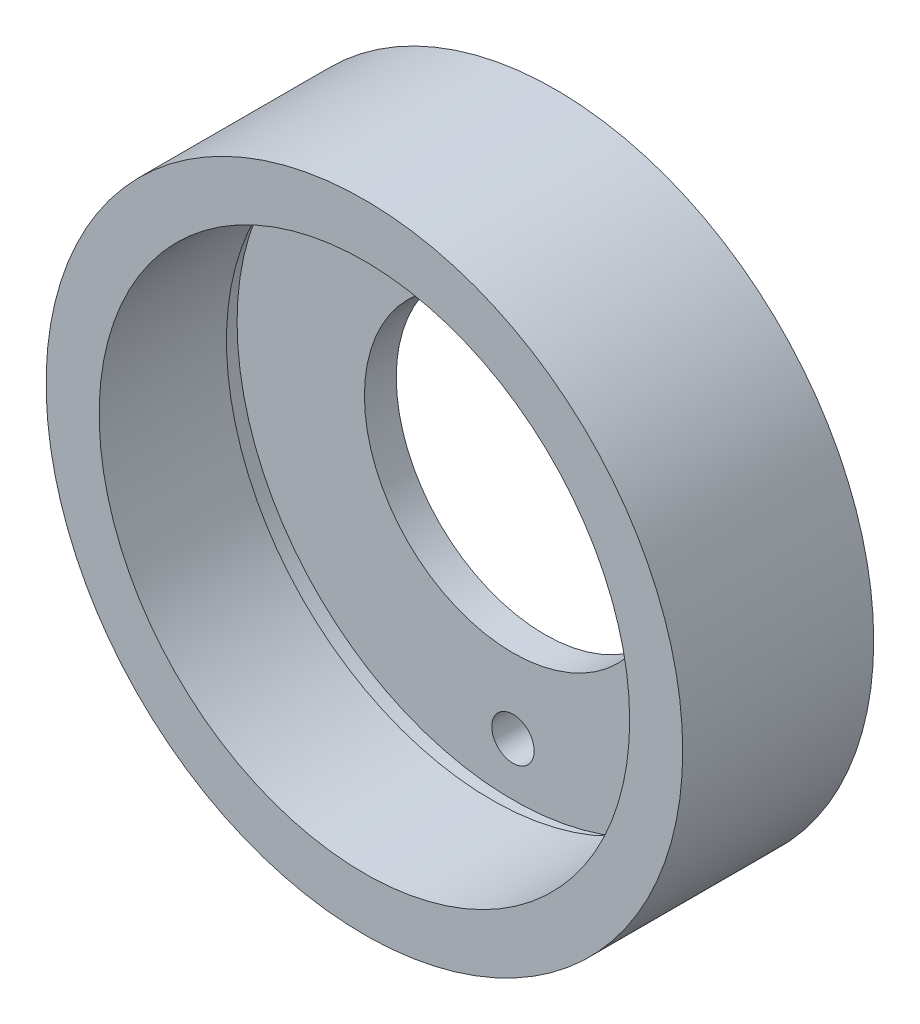
ISO-10303-21;
HEADER;
FILE_DESCRIPTION(('STEP AP214'),'2;1');
FILE_NAME('part.step','',(''),(''),'','','');
FILE_SCHEMA(('AUTOMOTIVE_DESIGN { 1 0 10303 214 1 1 1 1 }'));
ENDSEC;
DATA;
#1=APPLICATION_CONTEXT('core data for automotive mechanical design processes');
#2=APPLICATION_PROTOCOL_DEFINITION('international standard','automotive_design',2000,#1);
#3=PRODUCT_CONTEXT('',#1,'mechanical');
#4=PRODUCT('Part','Part','',(#3));
#5=PRODUCT_RELATED_PRODUCT_CATEGORY('part','',(#4));
#6=PRODUCT_DEFINITION_FORMATION('','',#4);
#7=PRODUCT_DEFINITION_CONTEXT('part definition',#1,'design');
#8=PRODUCT_DEFINITION('design','',#6,#7);
#9=PRODUCT_DEFINITION_SHAPE('','',#8);
#10=(LENGTH_UNIT() NAMED_UNIT(*) SI_UNIT(.MILLI.,.METRE.));
#11=(NAMED_UNIT(*) PLANE_ANGLE_UNIT() SI_UNIT($,.RADIAN.));
#12=(NAMED_UNIT(*) SI_UNIT($,.STERADIAN.) SOLID_ANGLE_UNIT());
#13=UNCERTAINTY_MEASURE_WITH_UNIT(LENGTH_MEASURE(1.E-05),#10,'distance_accuracy_value','');
#14=(GEOMETRIC_REPRESENTATION_CONTEXT(3) GLOBAL_UNCERTAINTY_ASSIGNED_CONTEXT((#13)) GLOBAL_UNIT_ASSIGNED_CONTEXT((#10,
#11,#12)) REPRESENTATION_CONTEXT('',''));
#15=CARTESIAN_POINT('',(0.,0.,0.));
#16=DIRECTION('',(0.,0.,1.));
#17=DIRECTION('',(1.,0.,0.));
#18=AXIS2_PLACEMENT_3D('',#15,#16,#17);
#19=CARTESIAN_POINT('',(0.,0.,2.));
#20=DIRECTION('',(0.,0.,-1.));
#21=DIRECTION('',(-1.,0.,0.));
#22=AXIS2_PLACEMENT_3D('',#19,#20,#21);
#23=CYLINDRICAL_SURFACE('',#22,15.);
#24=CARTESIAN_POINT('',(0.,0.,0.));
#25=DIRECTION('',(0.,0.,1.));
#26=DIRECTION('',(1.,0.,0.));
#27=AXIS2_PLACEMENT_3D('',#24,#25,#26);
#28=CIRCLE('',#27,15.);
#29=CARTESIAN_POINT('',(15.,0.,0.));
#30=VERTEX_POINT('',#29);
#31=EDGE_CURVE('E56',#30,#30,#28,.T.);
#32=ORIENTED_EDGE('',*,*,#31,.T.);
#33=EDGE_LOOP('',(#32));
#34=FACE_BOUND('',#33,.T.);
#35=CARTESIAN_POINT('',(0.,0.,9.));
#36=DIRECTION('',(0.,0.,1.));
#37=DIRECTION('',(1.,0.,0.));
#38=AXIS2_PLACEMENT_3D('',#35,#36,#37);
#39=CIRCLE('',#38,15.);
#40=CARTESIAN_POINT('',(15.,0.,9.));
#41=VERTEX_POINT('',#40);
#42=EDGE_CURVE('E94',#41,#41,#39,.T.);
#43=ORIENTED_EDGE('',*,*,#42,.F.);
#44=EDGE_LOOP('',(#43));
#45=FACE_BOUND('',#44,.T.);
#46=ADVANCED_FACE('F49',(#34,#45),#23,.T.);
#47=CARTESIAN_POINT('',(0.,0.,0.));
#48=DIRECTION('',(0.,0.,1.));
#49=DIRECTION('',(1.,0.,0.));
#50=AXIS2_PLACEMENT_3D('',#47,#48,#49);
#51=PLANE('',#50);
#52=CARTESIAN_POINT('',(0.,10.5,0.));
#53=DIRECTION('',(0.,0.,-1.));
#54=DIRECTION('',(-1.,0.,0.));
#55=AXIS2_PLACEMENT_3D('',#52,#53,#54);
#56=CIRCLE('',#55,1.025);
#57=CARTESIAN_POINT('',(-1.025,10.5,0.));
#58=VERTEX_POINT('',#57);
#59=EDGE_CURVE('E175',#58,#58,#56,.T.);
#60=ORIENTED_EDGE('',*,*,#59,.F.);
#61=EDGE_LOOP('',(#60));
#62=FACE_BOUND('',#61,.T.);
#63=CARTESIAN_POINT('',(0.,-10.5,0.));
#64=DIRECTION('',(0.,0.,-1.));
#65=DIRECTION('',(-1.,0.,0.));
#66=AXIS2_PLACEMENT_3D('',#63,#64,#65);
#67=CIRCLE('',#66,1.025);
#68=CARTESIAN_POINT('',(-1.02499999999993,-10.5,0.));
#69=VERTEX_POINT('',#68);
#70=EDGE_CURVE('E74',#69,#69,#67,.T.);
#71=ORIENTED_EDGE('',*,*,#70,.F.);
#72=EDGE_LOOP('',(#71));
#73=FACE_BOUND('',#72,.T.);
#74=CARTESIAN_POINT('',(0.,0.,0.));
#75=DIRECTION('',(0.,0.,-1.));
#76=DIRECTION('',(-1.,0.,0.));
#77=AXIS2_PLACEMENT_3D('',#74,#75,#76);
#78=CIRCLE('',#77,8.5);
#79=CARTESIAN_POINT('',(-8.5,0.,0.));
#80=VERTEX_POINT('',#79);
#81=EDGE_CURVE('E83',#80,#80,#78,.T.);
#82=ORIENTED_EDGE('',*,*,#81,.F.);
#83=EDGE_LOOP('',(#82));
#84=FACE_BOUND('',#83,.T.);
#85=ORIENTED_EDGE('',*,*,#31,.F.);
#86=EDGE_LOOP('',(#85));
#87=FACE_BOUND('',#86,.T.);
#88=ADVANCED_FACE('F106',(#62,#73,#84,#87),#51,.F.);
#89=CARTESIAN_POINT('',(0.,0.,3.));
#90=DIRECTION('',(0.,0.,1.));
#91=DIRECTION('',(1.,0.,0.));
#92=AXIS2_PLACEMENT_3D('',#89,#90,#91);
#93=PLANE('',#92);
#94=CARTESIAN_POINT('',(0.,0.,3.));
#95=DIRECTION('',(0.,0.,1.));
#96=DIRECTION('',(1.,0.,0.));
#97=AXIS2_PLACEMENT_3D('',#94,#95,#96);
#98=CIRCLE('',#97,12.5);
#99=CARTESIAN_POINT('',(12.5,0.,3.));
#100=VERTEX_POINT('',#99);
#101=EDGE_CURVE('E88',#100,#100,#98,.T.);
#102=ORIENTED_EDGE('',*,*,#101,.T.);
#103=EDGE_LOOP('',(#102));
#104=FACE_BOUND('',#103,.T.);
#105=CARTESIAN_POINT('',(0.,0.,3.));
#106=DIRECTION('',(0.,0.,1.));
#107=DIRECTION('',(1.,0.,0.));
#108=AXIS2_PLACEMENT_3D('',#105,#106,#107);
#109=CIRCLE('',#108,13.);
#110=CARTESIAN_POINT('',(13.,0.,3.));
#111=VERTEX_POINT('',#110);
#112=EDGE_CURVE('E61',#111,#111,#109,.T.);
#113=ORIENTED_EDGE('',*,*,#112,.F.);
#114=EDGE_LOOP('',(#113));
#115=FACE_BOUND('',#114,.T.);
#116=ADVANCED_FACE('F103',(#104,#115),#93,.F.);
#117=CARTESIAN_POINT('',(0.,0.,9.));
#118=DIRECTION('',(0.,0.,1.));
#119=DIRECTION('',(1.,0.,0.));
#120=AXIS2_PLACEMENT_3D('',#117,#118,#119);
#121=PLANE('',#120);
#122=ORIENTED_EDGE('',*,*,#42,.T.);
#123=EDGE_LOOP('',(#122));
#124=FACE_BOUND('',#123,.T.);
#125=CARTESIAN_POINT('',(0.,0.,9.));
#126=DIRECTION('',(0.,0.,1.));
#127=DIRECTION('',(1.,0.,0.));
#128=AXIS2_PLACEMENT_3D('',#125,#126,#127);
#129=CIRCLE('',#128,12.5);
#130=CARTESIAN_POINT('',(12.5,0.,9.));
#131=VERTEX_POINT('',#130);
#132=EDGE_CURVE('E91',#131,#131,#129,.T.);
#133=ORIENTED_EDGE('',*,*,#132,.F.);
#134=EDGE_LOOP('',(#133));
#135=FACE_BOUND('',#134,.T.);
#136=ADVANCED_FACE('F105',(#124,#135),#121,.T.);
#137=CARTESIAN_POINT('',(0.,0.,9.));
#138=DIRECTION('',(0.,0.,-1.));
#139=DIRECTION('',(-1.,0.,0.));
#140=AXIS2_PLACEMENT_3D('',#137,#138,#139);
#141=CYLINDRICAL_SURFACE('',#140,12.5);
#142=ORIENTED_EDGE('',*,*,#132,.T.);
#143=EDGE_LOOP('',(#142));
#144=FACE_BOUND('',#143,.T.);
#145=ORIENTED_EDGE('',*,*,#101,.F.);
#146=EDGE_LOOP('',(#145));
#147=FACE_BOUND('',#146,.T.);
#148=ADVANCED_FACE('F114',(#144,#147),#141,.F.);
#149=CARTESIAN_POINT('',(0.,0.,2.));
#150=DIRECTION('',(0.,0.,1.));
#151=DIRECTION('',(1.,0.,0.));
#152=AXIS2_PLACEMENT_3D('',#149,#150,#151);
#153=PLANE('',#152);
#154=CARTESIAN_POINT('',(0.,10.5,2.));
#155=DIRECTION('',(0.,0.,1.));
#156=DIRECTION('',(1.,0.,0.));
#157=AXIS2_PLACEMENT_3D('',#154,#155,#156);
#158=CIRCLE('',#157,0.999999999999998);
#159=CARTESIAN_POINT('',(0.999999999999998,10.5,2.));
#160=VERTEX_POINT('',#159);
#161=EDGE_CURVE('E52',#160,#160,#158,.T.);
#162=ORIENTED_EDGE('',*,*,#161,.F.);
#163=EDGE_LOOP('',(#162));
#164=FACE_BOUND('',#163,.T.);
#165=CARTESIAN_POINT('',(0.,-10.5,2.));
#166=DIRECTION('',(0.,0.,1.));
#167=DIRECTION('',(1.,0.,0.));
#168=AXIS2_PLACEMENT_3D('',#165,#166,#167);
#169=CIRCLE('',#168,0.999999999999998);
#170=CARTESIAN_POINT('',(1.00000000000007,-10.5,2.));
#171=VERTEX_POINT('',#170);
#172=EDGE_CURVE('E64',#171,#171,#169,.T.);
#173=ORIENTED_EDGE('',*,*,#172,.F.);
#174=EDGE_LOOP('',(#173));
#175=FACE_BOUND('',#174,.T.);
#176=CARTESIAN_POINT('',(0.,0.,2.));
#177=DIRECTION('',(0.,0.,-1.));
#178=DIRECTION('',(-1.,0.,0.));
#179=AXIS2_PLACEMENT_3D('',#176,#177,#178);
#180=CIRCLE('',#179,7.);
#181=CARTESIAN_POINT('',(-7.,0.,2.));
#182=VERTEX_POINT('',#181);
#183=EDGE_CURVE('E71',#182,#182,#180,.T.);
#184=ORIENTED_EDGE('',*,*,#183,.T.);
#185=EDGE_LOOP('',(#184));
#186=FACE_BOUND('',#185,.T.);
#187=CARTESIAN_POINT('',(0.,0.,2.));
#188=DIRECTION('',(0.,0.,1.));
#189=DIRECTION('',(1.,0.,0.));
#190=AXIS2_PLACEMENT_3D('',#187,#188,#189);
#191=CIRCLE('',#190,13.);
#192=CARTESIAN_POINT('',(13.,0.,2.));
#193=VERTEX_POINT('',#192);
#194=EDGE_CURVE('E10',#193,#193,#191,.F.);
#195=ORIENTED_EDGE('',*,*,#194,.F.);
#196=EDGE_LOOP('',(#195));
#197=FACE_BOUND('',#196,.T.);
#198=ADVANCED_FACE('F132',(#164,#175,#186,#197),#153,.T.);
#199=CARTESIAN_POINT('',(0.,0.,3.));
#200=DIRECTION('',(0.,0.,-1.));
#201=DIRECTION('',(-1.,0.,0.));
#202=AXIS2_PLACEMENT_3D('',#199,#200,#201);
#203=CYLINDRICAL_SURFACE('',#202,13.);
#204=ORIENTED_EDGE('',*,*,#112,.T.);
#205=EDGE_LOOP('',(#204));
#206=FACE_BOUND('',#205,.T.);
#207=ORIENTED_EDGE('',*,*,#194,.T.);
#208=EDGE_LOOP('',(#207));
#209=FACE_BOUND('',#208,.T.);
#210=ADVANCED_FACE('F101',(#206,#209),#203,.F.);
#211=CARTESIAN_POINT('',(0.,0.,0.5));
#212=DIRECTION('',(0.,0.,-1.));
#213=DIRECTION('',(-1.,0.,0.));
#214=AXIS2_PLACEMENT_3D('',#211,#212,#213);
#215=CYLINDRICAL_SURFACE('',#214,8.5);
#216=CARTESIAN_POINT('',(0.,0.,0.5));
#217=DIRECTION('',(0.,0.,-1.));
#218=DIRECTION('',(-1.,0.,0.));
#219=AXIS2_PLACEMENT_3D('',#216,#217,#218);
#220=CIRCLE('',#219,8.5);
#221=CARTESIAN_POINT('',(-8.5,0.,0.5));
#222=VERTEX_POINT('',#221);
#223=EDGE_CURVE('E85',#222,#222,#220,.T.);
#224=ORIENTED_EDGE('',*,*,#223,.F.);
#225=EDGE_LOOP('',(#224));
#226=FACE_BOUND('',#225,.T.);
#227=ORIENTED_EDGE('',*,*,#81,.T.);
#228=EDGE_LOOP('',(#227));
#229=FACE_BOUND('',#228,.T.);
#230=ADVANCED_FACE('F141',(#226,#229),#215,.F.);
#231=CARTESIAN_POINT('',(0.,0.,0.5));
#232=DIRECTION('',(0.,0.,-1.));
#233=DIRECTION('',(-1.,0.,0.));
#234=AXIS2_PLACEMENT_3D('',#231,#232,#233);
#235=PLANE('',#234);
#236=CARTESIAN_POINT('',(0.,0.,0.5));
#237=DIRECTION('',(0.,0.,-1.));
#238=DIRECTION('',(-1.,0.,0.));
#239=AXIS2_PLACEMENT_3D('',#236,#237,#238);
#240=CIRCLE('',#239,7.);
#241=CARTESIAN_POINT('',(-7.,0.,0.5));
#242=VERTEX_POINT('',#241);
#243=EDGE_CURVE('E66',#242,#242,#240,.T.);
#244=ORIENTED_EDGE('',*,*,#243,.F.);
#245=EDGE_LOOP('',(#244));
#246=FACE_BOUND('',#245,.T.);
#247=ORIENTED_EDGE('',*,*,#223,.T.);
#248=EDGE_LOOP('',(#247));
#249=FACE_BOUND('',#248,.T.);
#250=ADVANCED_FACE('F144',(#246,#249),#235,.T.);
#251=CARTESIAN_POINT('',(0.,0.,2.));
#252=DIRECTION('',(0.,0.,-1.));
#253=DIRECTION('',(-1.,0.,0.));
#254=AXIS2_PLACEMENT_3D('',#251,#252,#253);
#255=CYLINDRICAL_SURFACE('',#254,7.);
#256=ORIENTED_EDGE('',*,*,#183,.F.);
#257=EDGE_LOOP('',(#256));
#258=FACE_BOUND('',#257,.T.);
#259=ORIENTED_EDGE('',*,*,#243,.T.);
#260=EDGE_LOOP('',(#259));
#261=FACE_BOUND('',#260,.T.);
#262=ADVANCED_FACE('F148',(#258,#261),#255,.F.);
#263=CARTESIAN_POINT('',(0.,-10.5,0.));
#264=DIRECTION('',(0.,0.,-1.));
#265=DIRECTION('',(-1.,0.,0.));
#266=AXIS2_PLACEMENT_3D('',#263,#264,#265);
#267=CYLINDRICAL_SURFACE('',#266,0.999999999999998);
#268=ORIENTED_EDGE('',*,*,#172,.T.);
#269=EDGE_LOOP('',(#268));
#270=FACE_BOUND('',#269,.T.);
#271=CARTESIAN_POINT('',(0.,-10.5,0.0250000000000007));
#272=DIRECTION('',(0.,0.,-1.));
#273=DIRECTION('',(-1.,0.,0.));
#274=AXIS2_PLACEMENT_3D('',#271,#272,#273);
#275=CIRCLE('',#274,0.999999999999999);
#276=CARTESIAN_POINT('',(-0.999999999999926,-10.5,0.0250000000000007));
#277=VERTEX_POINT('',#276);
#278=EDGE_CURVE('E67',#277,#277,#275,.T.);
#279=ORIENTED_EDGE('',*,*,#278,.T.);
#280=EDGE_LOOP('',(#279));
#281=FACE_BOUND('',#280,.T.);
#282=ADVANCED_FACE('F152',(#270,#281),#267,.F.);
#283=CARTESIAN_POINT('',(0.,-10.5,0.));
#284=DIRECTION('',(0.,0.,-1.));
#285=DIRECTION('',(-1.,0.,0.));
#286=AXIS2_PLACEMENT_3D('',#283,#284,#285);
#287=CONICAL_SURFACE('',#286,1.025,0.785398163397453);
#288=ORIENTED_EDGE('',*,*,#278,.F.);
#289=EDGE_LOOP('',(#288));
#290=FACE_BOUND('',#289,.T.);
#291=ORIENTED_EDGE('',*,*,#70,.T.);
#292=EDGE_LOOP('',(#291));
#293=FACE_BOUND('',#292,.T.);
#294=ADVANCED_FACE('F156',(#290,#293),#287,.F.);
#295=CARTESIAN_POINT('',(0.,10.5,0.));
#296=DIRECTION('',(0.,0.,-1.));
#297=DIRECTION('',(-1.,0.,0.));
#298=AXIS2_PLACEMENT_3D('',#295,#296,#297);
#299=CYLINDRICAL_SURFACE('',#298,0.999999999999998);
#300=ORIENTED_EDGE('',*,*,#161,.T.);
#301=EDGE_LOOP('',(#300));
#302=FACE_BOUND('',#301,.T.);
#303=CARTESIAN_POINT('',(0.,10.5,0.0250000000000007));
#304=DIRECTION('',(0.,0.,-1.));
#305=DIRECTION('',(-1.,0.,0.));
#306=AXIS2_PLACEMENT_3D('',#303,#304,#305);
#307=CIRCLE('',#306,0.999999999999999);
#308=CARTESIAN_POINT('',(-0.999999999999999,10.5,0.0250000000000007));
#309=VERTEX_POINT('',#308);
#310=EDGE_CURVE('E172',#309,#309,#307,.T.);
#311=ORIENTED_EDGE('',*,*,#310,.T.);
#312=EDGE_LOOP('',(#311));
#313=FACE_BOUND('',#312,.T.);
#314=ADVANCED_FACE('F159',(#302,#313),#299,.F.);
#315=CARTESIAN_POINT('',(0.,10.5,0.));
#316=DIRECTION('',(0.,0.,-1.));
#317=DIRECTION('',(-1.,0.,0.));
#318=AXIS2_PLACEMENT_3D('',#315,#316,#317);
#319=CONICAL_SURFACE('',#318,1.025,0.785398163397453);
#320=ORIENTED_EDGE('',*,*,#310,.F.);
#321=EDGE_LOOP('',(#320));
#322=FACE_BOUND('',#321,.T.);
#323=ORIENTED_EDGE('',*,*,#59,.T.);
#324=EDGE_LOOP('',(#323));
#325=FACE_BOUND('',#324,.T.);
#326=ADVANCED_FACE('F163',(#322,#325),#319,.F.);
#327=CLOSED_SHELL('',(#46,#88,#116,#136,#148,#198,#210,#230,#250,#262,#282,#294,#314,#326));
#328=MANIFOLD_SOLID_BREP('B2',#327);
#329=ADVANCED_BREP_SHAPE_REPRESENTATION('',(#18,#328),#14);
#330=SHAPE_DEFINITION_REPRESENTATION(#9,#329);
ENDSEC;
END-ISO-10303-21;
